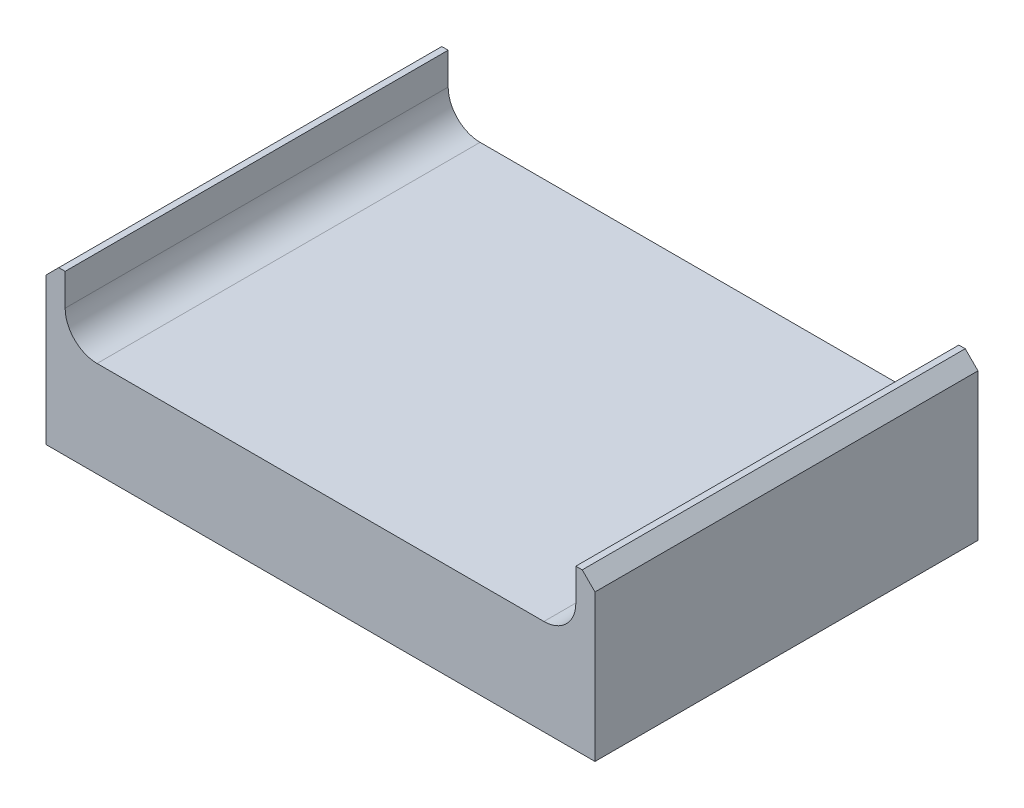
ISO-10303-21;
HEADER;
FILE_DESCRIPTION(('STEP AP214'),'2;1');
FILE_NAME('part.step','',(''),(''),'','','');
FILE_SCHEMA(('AUTOMOTIVE_DESIGN { 1 0 10303 214 1 1 1 1 }'));
ENDSEC;
DATA;
#1=APPLICATION_CONTEXT('core data for automotive mechanical design processes');
#2=APPLICATION_PROTOCOL_DEFINITION('international standard','automotive_design',2000,#1);
#3=PRODUCT_CONTEXT('',#1,'mechanical');
#4=PRODUCT('Part','Part','',(#3));
#5=PRODUCT_RELATED_PRODUCT_CATEGORY('part','',(#4));
#6=PRODUCT_DEFINITION_FORMATION('','',#4);
#7=PRODUCT_DEFINITION_CONTEXT('part definition',#1,'design');
#8=PRODUCT_DEFINITION('design','',#6,#7);
#9=PRODUCT_DEFINITION_SHAPE('','',#8);
#10=(LENGTH_UNIT() NAMED_UNIT(*) SI_UNIT(.MILLI.,.METRE.));
#11=(NAMED_UNIT(*) PLANE_ANGLE_UNIT() SI_UNIT($,.RADIAN.));
#12=(NAMED_UNIT(*) SI_UNIT($,.STERADIAN.) SOLID_ANGLE_UNIT());
#13=UNCERTAINTY_MEASURE_WITH_UNIT(LENGTH_MEASURE(1.E-05),#10,'distance_accuracy_value','');
#14=(GEOMETRIC_REPRESENTATION_CONTEXT(3) GLOBAL_UNCERTAINTY_ASSIGNED_CONTEXT((#13)) GLOBAL_UNIT_ASSIGNED_CONTEXT((#10,
#11,#12)) REPRESENTATION_CONTEXT('',''));
#15=CARTESIAN_POINT('',(0.,0.,0.));
#16=DIRECTION('',(0.,0.,1.));
#17=DIRECTION('',(1.,0.,0.));
#18=AXIS2_PLACEMENT_3D('',#15,#16,#17);
#19=CARTESIAN_POINT('',(43.,12.5,60.));
#20=DIRECTION('',(-1.,0.,0.));
#21=DIRECTION('',(0.,-1.,0.));
#22=AXIS2_PLACEMENT_3D('',#19,#20,#21);
#23=PLANE('',#22);
#24=DIRECTION('',(0.,1.,0.));
#25=VECTOR('',#24,1.);
#26=CARTESIAN_POINT('',(43.,12.5,0.));
#27=LINE('',#26,#25);
#28=CARTESIAN_POINT('',(43.,-12.5,0.));
#29=VERTEX_POINT('',#28);
#30=CARTESIAN_POINT('',(43.,10.5,0.));
#31=VERTEX_POINT('',#30);
#32=EDGE_CURVE('E163',#29,#31,#27,.T.);
#33=ORIENTED_EDGE('',*,*,#32,.T.);
#34=DIRECTION('',(0.,0.,1.));
#35=VECTOR('',#34,1.);
#36=CARTESIAN_POINT('',(43.,10.5,60.));
#37=LINE('',#36,#35);
#38=CARTESIAN_POINT('',(43.,10.5,60.));
#39=VERTEX_POINT('',#38);
#40=EDGE_CURVE('E12',#31,#39,#37,.T.);
#41=ORIENTED_EDGE('',*,*,#40,.T.);
#42=DIRECTION('',(0.,1.,0.));
#43=VECTOR('',#42,1.);
#44=CARTESIAN_POINT('',(43.,12.5,60.));
#45=LINE('',#44,#43);
#46=CARTESIAN_POINT('',(43.,-12.5,60.));
#47=VERTEX_POINT('',#46);
#48=EDGE_CURVE('E132',#47,#39,#45,.T.);
#49=ORIENTED_EDGE('',*,*,#48,.F.);
#50=DIRECTION('',(0.,0.,-1.));
#51=VECTOR('',#50,1.);
#52=CARTESIAN_POINT('',(43.,-12.5,60.));
#53=LINE('',#52,#51);
#54=EDGE_CURVE('E162',#47,#29,#53,.T.);
#55=ORIENTED_EDGE('',*,*,#54,.T.);
#56=EDGE_LOOP('',(#33,#41,#49,#55));
#57=FACE_BOUND('',#56,.T.);
#58=ADVANCED_FACE('F35',(#57),#23,.F.);
#59=CARTESIAN_POINT('',(40.,12.5,60.));
#60=DIRECTION('',(0.,-1.,0.));
#61=DIRECTION('',(0.,0.,-1.));
#62=AXIS2_PLACEMENT_3D('',#59,#60,#61);
#63=PLANE('',#62);
#64=DIRECTION('',(-1.,0.,0.));
#65=VECTOR('',#64,1.);
#66=CARTESIAN_POINT('',(40.,12.5,60.));
#67=LINE('',#66,#65);
#68=CARTESIAN_POINT('',(41.,12.5,60.));
#69=VERTEX_POINT('',#68);
#70=CARTESIAN_POINT('',(40.,12.5,60.));
#71=VERTEX_POINT('',#70);
#72=EDGE_CURVE('E122',#69,#71,#67,.T.);
#73=ORIENTED_EDGE('',*,*,#72,.F.);
#74=DIRECTION('',(0.,0.,-1.));
#75=VECTOR('',#74,1.);
#76=CARTESIAN_POINT('',(41.,12.5,60.));
#77=LINE('',#76,#75);
#78=CARTESIAN_POINT('',(41.,12.5,0.));
#79=VERTEX_POINT('',#78);
#80=EDGE_CURVE('E43',#69,#79,#77,.T.);
#81=ORIENTED_EDGE('',*,*,#80,.T.);
#82=DIRECTION('',(-1.,0.,0.));
#83=VECTOR('',#82,1.);
#84=CARTESIAN_POINT('',(40.,12.5,0.));
#85=LINE('',#84,#83);
#86=CARTESIAN_POINT('',(40.,12.5,0.));
#87=VERTEX_POINT('',#86);
#88=EDGE_CURVE('E138',#79,#87,#85,.T.);
#89=ORIENTED_EDGE('',*,*,#88,.T.);
#90=DIRECTION('',(0.,0.,-1.));
#91=VECTOR('',#90,1.);
#92=CARTESIAN_POINT('',(40.,12.5,60.));
#93=LINE('',#92,#91);
#94=EDGE_CURVE('E135',#71,#87,#93,.T.);
#95=ORIENTED_EDGE('',*,*,#94,.F.);
#96=EDGE_LOOP('',(#73,#81,#89,#95));
#97=FACE_BOUND('',#96,.T.);
#98=ADVANCED_FACE('F136',(#97),#63,.F.);
#99=CARTESIAN_POINT('',(40.,12.5,60.));
#100=DIRECTION('',(1.,0.,0.));
#101=DIRECTION('',(0.,0.,-1.));
#102=AXIS2_PLACEMENT_3D('',#99,#100,#101);
#103=PLANE('',#102);
#104=DIRECTION('',(0.,-1.,0.));
#105=VECTOR('',#104,1.);
#106=CARTESIAN_POINT('',(40.,12.5,0.));
#107=LINE('',#106,#105);
#108=CARTESIAN_POINT('',(40.,7.50000000000001,0.));
#109=VERTEX_POINT('',#108);
#110=EDGE_CURVE('E166',#87,#109,#107,.T.);
#111=ORIENTED_EDGE('',*,*,#110,.T.);
#112=DIRECTION('',(0.,0.,-1.));
#113=VECTOR('',#112,1.);
#114=CARTESIAN_POINT('',(40.,7.50000000000001,60.));
#115=LINE('',#114,#113);
#116=CARTESIAN_POINT('',(40.,7.50000000000001,60.));
#117=VERTEX_POINT('',#116);
#118=EDGE_CURVE('E147',#109,#117,#115,.F.);
#119=ORIENTED_EDGE('',*,*,#118,.T.);
#120=DIRECTION('',(0.,-1.,0.));
#121=VECTOR('',#120,1.);
#122=CARTESIAN_POINT('',(40.,12.5,60.));
#123=LINE('',#122,#121);
#124=EDGE_CURVE('E127',#71,#117,#123,.T.);
#125=ORIENTED_EDGE('',*,*,#124,.F.);
#126=ORIENTED_EDGE('',*,*,#94,.T.);
#127=EDGE_LOOP('',(#111,#119,#125,#126));
#128=FACE_BOUND('',#127,.T.);
#129=ADVANCED_FACE('F145',(#128),#103,.F.);
#130=CARTESIAN_POINT('',(-40.,2.50000000000001,60.));
#131=DIRECTION('',(0.,-1.,0.));
#132=DIRECTION('',(0.,0.,-1.));
#133=AXIS2_PLACEMENT_3D('',#130,#131,#132);
#134=PLANE('',#133);
#135=DIRECTION('',(-1.,0.,0.));
#136=VECTOR('',#135,1.);
#137=CARTESIAN_POINT('',(-40.,2.50000000000001,0.));
#138=LINE('',#137,#136);
#139=CARTESIAN_POINT('',(35.,2.50000000000001,0.));
#140=VERTEX_POINT('',#139);
#141=CARTESIAN_POINT('',(-35.,2.50000000000001,0.));
#142=VERTEX_POINT('',#141);
#143=EDGE_CURVE('E168',#140,#142,#138,.T.);
#144=ORIENTED_EDGE('',*,*,#143,.T.);
#145=DIRECTION('',(0.,0.,-1.));
#146=VECTOR('',#145,1.);
#147=CARTESIAN_POINT('',(-35.,2.50000000000001,60.));
#148=LINE('',#147,#146);
#149=CARTESIAN_POINT('',(-35.,2.50000000000001,60.));
#150=VERTEX_POINT('',#149);
#151=EDGE_CURVE('E192',#142,#150,#148,.F.);
#152=ORIENTED_EDGE('',*,*,#151,.T.);
#153=DIRECTION('',(-1.,0.,0.));
#154=VECTOR('',#153,1.);
#155=CARTESIAN_POINT('',(-40.,2.50000000000001,60.));
#156=LINE('',#155,#154);
#157=CARTESIAN_POINT('',(35.,2.50000000000001,60.));
#158=VERTEX_POINT('',#157);
#159=EDGE_CURVE('E148',#158,#150,#156,.T.);
#160=ORIENTED_EDGE('',*,*,#159,.F.);
#161=DIRECTION('',(0.,0.,-1.));
#162=VECTOR('',#161,1.);
#163=CARTESIAN_POINT('',(35.,2.50000000000001,0.));
#164=LINE('',#163,#162);
#165=EDGE_CURVE('E189',#158,#140,#164,.T.);
#166=ORIENTED_EDGE('',*,*,#165,.T.);
#167=EDGE_LOOP('',(#144,#152,#160,#166));
#168=FACE_BOUND('',#167,.T.);
#169=ADVANCED_FACE('F226',(#168),#134,.F.);
#170=CARTESIAN_POINT('',(-40.,12.5,60.));
#171=DIRECTION('',(-1.,0.,0.));
#172=DIRECTION('',(0.,0.,1.));
#173=AXIS2_PLACEMENT_3D('',#170,#171,#172);
#174=PLANE('',#173);
#175=DIRECTION('',(0.,1.,0.));
#176=VECTOR('',#175,1.);
#177=CARTESIAN_POINT('',(-40.,12.5,60.));
#178=LINE('',#177,#176);
#179=CARTESIAN_POINT('',(-40.,7.50000000000001,60.));
#180=VERTEX_POINT('',#179);
#181=CARTESIAN_POINT('',(-40.,12.5,60.));
#182=VERTEX_POINT('',#181);
#183=EDGE_CURVE('E151',#180,#182,#178,.T.);
#184=ORIENTED_EDGE('',*,*,#183,.F.);
#185=DIRECTION('',(0.,0.,-1.));
#186=VECTOR('',#185,1.);
#187=CARTESIAN_POINT('',(-40.,7.50000000000001,0.));
#188=LINE('',#187,#186);
#189=CARTESIAN_POINT('',(-40.,7.50000000000001,0.));
#190=VERTEX_POINT('',#189);
#191=EDGE_CURVE('E142',#180,#190,#188,.T.);
#192=ORIENTED_EDGE('',*,*,#191,.T.);
#193=DIRECTION('',(0.,1.,0.));
#194=VECTOR('',#193,1.);
#195=CARTESIAN_POINT('',(-40.,12.5,0.));
#196=LINE('',#195,#194);
#197=CARTESIAN_POINT('',(-40.,12.5,0.));
#198=VERTEX_POINT('',#197);
#199=EDGE_CURVE('E171',#190,#198,#196,.T.);
#200=ORIENTED_EDGE('',*,*,#199,.T.);
#201=DIRECTION('',(0.,0.,-1.));
#202=VECTOR('',#201,1.);
#203=CARTESIAN_POINT('',(-40.,12.5,60.));
#204=LINE('',#203,#202);
#205=EDGE_CURVE('E143',#182,#198,#204,.T.);
#206=ORIENTED_EDGE('',*,*,#205,.F.);
#207=EDGE_LOOP('',(#184,#192,#200,#206));
#208=FACE_BOUND('',#207,.T.);
#209=ADVANCED_FACE('F234',(#208),#174,.F.);
#210=CARTESIAN_POINT('',(-43.,12.5,60.));
#211=DIRECTION('',(0.,-1.,0.));
#212=DIRECTION('',(0.,0.,-1.));
#213=AXIS2_PLACEMENT_3D('',#210,#211,#212);
#214=PLANE('',#213);
#215=DIRECTION('',(-1.,0.,0.));
#216=VECTOR('',#215,1.);
#217=CARTESIAN_POINT('',(-43.,12.5,0.));
#218=LINE('',#217,#216);
#219=CARTESIAN_POINT('',(-41.,12.5,0.));
#220=VERTEX_POINT('',#219);
#221=EDGE_CURVE('E173',#198,#220,#218,.T.);
#222=ORIENTED_EDGE('',*,*,#221,.T.);
#223=DIRECTION('',(0.,0.,1.));
#224=VECTOR('',#223,1.);
#225=CARTESIAN_POINT('',(-41.,12.5,60.));
#226=LINE('',#225,#224);
#227=CARTESIAN_POINT('',(-41.,12.5,60.));
#228=VERTEX_POINT('',#227);
#229=EDGE_CURVE('E210',#220,#228,#226,.T.);
#230=ORIENTED_EDGE('',*,*,#229,.T.);
#231=DIRECTION('',(-1.,0.,0.));
#232=VECTOR('',#231,1.);
#233=CARTESIAN_POINT('',(-43.,12.5,60.));
#234=LINE('',#233,#232);
#235=EDGE_CURVE('E156',#182,#228,#234,.T.);
#236=ORIENTED_EDGE('',*,*,#235,.F.);
#237=ORIENTED_EDGE('',*,*,#205,.T.);
#238=EDGE_LOOP('',(#222,#230,#236,#237));
#239=FACE_BOUND('',#238,.T.);
#240=ADVANCED_FACE('F239',(#239),#214,.F.);
#241=CARTESIAN_POINT('',(-43.,12.5,60.));
#242=DIRECTION('',(1.,0.,0.));
#243=DIRECTION('',(0.,1.,0.));
#244=AXIS2_PLACEMENT_3D('',#241,#242,#243);
#245=PLANE('',#244);
#246=DIRECTION('',(0.,-1.,0.));
#247=VECTOR('',#246,1.);
#248=CARTESIAN_POINT('',(-43.,12.5,60.));
#249=LINE('',#248,#247);
#250=CARTESIAN_POINT('',(-43.,10.5,60.));
#251=VERTEX_POINT('',#250);
#252=CARTESIAN_POINT('',(-43.,-12.5,60.));
#253=VERTEX_POINT('',#252);
#254=EDGE_CURVE('E158',#251,#253,#249,.T.);
#255=ORIENTED_EDGE('',*,*,#254,.F.);
#256=DIRECTION('',(0.,0.,-1.));
#257=VECTOR('',#256,1.);
#258=CARTESIAN_POINT('',(-43.,10.5,60.));
#259=LINE('',#258,#257);
#260=CARTESIAN_POINT('',(-43.,10.5,0.));
#261=VERTEX_POINT('',#260);
#262=EDGE_CURVE('E203',#251,#261,#259,.T.);
#263=ORIENTED_EDGE('',*,*,#262,.T.);
#264=DIRECTION('',(0.,-1.,0.));
#265=VECTOR('',#264,1.);
#266=CARTESIAN_POINT('',(-43.,12.5,0.));
#267=LINE('',#266,#265);
#268=CARTESIAN_POINT('',(-43.,-12.5,0.));
#269=VERTEX_POINT('',#268);
#270=EDGE_CURVE('E176',#261,#269,#267,.T.);
#271=ORIENTED_EDGE('',*,*,#270,.T.);
#272=DIRECTION('',(0.,0.,-1.));
#273=VECTOR('',#272,1.);
#274=CARTESIAN_POINT('',(-43.,-12.5,60.));
#275=LINE('',#274,#273);
#276=EDGE_CURVE('E182',#253,#269,#275,.T.);
#277=ORIENTED_EDGE('',*,*,#276,.F.);
#278=EDGE_LOOP('',(#255,#263,#271,#277));
#279=FACE_BOUND('',#278,.T.);
#280=ADVANCED_FACE('F247',(#279),#245,.F.);
#281=CARTESIAN_POINT('',(-43.,-12.5,60.));
#282=DIRECTION('',(0.,1.,0.));
#283=DIRECTION('',(0.,0.,1.));
#284=AXIS2_PLACEMENT_3D('',#281,#282,#283);
#285=PLANE('',#284);
#286=DIRECTION('',(1.,0.,0.));
#287=VECTOR('',#286,1.);
#288=CARTESIAN_POINT('',(-43.,-12.5,0.));
#289=LINE('',#288,#287);
#290=EDGE_CURVE('E178',#269,#29,#289,.T.);
#291=ORIENTED_EDGE('',*,*,#290,.T.);
#292=ORIENTED_EDGE('',*,*,#54,.F.);
#293=DIRECTION('',(1.,0.,0.));
#294=VECTOR('',#293,1.);
#295=CARTESIAN_POINT('',(-43.,-12.5,60.));
#296=LINE('',#295,#294);
#297=EDGE_CURVE('E160',#253,#47,#296,.T.);
#298=ORIENTED_EDGE('',*,*,#297,.F.);
#299=ORIENTED_EDGE('',*,*,#276,.T.);
#300=EDGE_LOOP('',(#291,#292,#298,#299));
#301=FACE_BOUND('',#300,.T.);
#302=ADVANCED_FACE('F252',(#301),#285,.F.);
#303=CARTESIAN_POINT('',(0.,0.,60.));
#304=DIRECTION('',(0.,0.,1.));
#305=DIRECTION('',(1.,0.,0.));
#306=AXIS2_PLACEMENT_3D('',#303,#304,#305);
#307=PLANE('',#306);
#308=ORIENTED_EDGE('',*,*,#235,.T.);
#309=DIRECTION('',(0.707106781186548,0.707106781186548,0.));
#310=VECTOR('',#309,1.);
#311=CARTESIAN_POINT('',(-26.75,26.75,60.));
#312=LINE('',#311,#310);
#313=EDGE_CURVE('E213',#228,#251,#312,.F.);
#314=ORIENTED_EDGE('',*,*,#313,.T.);
#315=ORIENTED_EDGE('',*,*,#254,.T.);
#316=ORIENTED_EDGE('',*,*,#297,.T.);
#317=ORIENTED_EDGE('',*,*,#48,.T.);
#318=DIRECTION('',(0.707106781186548,-0.707106781186548,0.));
#319=VECTOR('',#318,1.);
#320=CARTESIAN_POINT('',(26.75,26.75,60.));
#321=LINE('',#320,#319);
#322=EDGE_CURVE('E50',#39,#69,#321,.F.);
#323=ORIENTED_EDGE('',*,*,#322,.T.);
#324=ORIENTED_EDGE('',*,*,#72,.T.);
#325=ORIENTED_EDGE('',*,*,#124,.T.);
#326=CARTESIAN_POINT('',(35.,7.50000000000001,60.));
#327=DIRECTION('',(0.,0.,1.));
#328=DIRECTION('',(1.,0.,0.));
#329=AXIS2_PLACEMENT_3D('',#326,#327,#328);
#330=CIRCLE('',#329,5.);
#331=EDGE_CURVE('E201',#117,#158,#330,.F.);
#332=ORIENTED_EDGE('',*,*,#331,.T.);
#333=ORIENTED_EDGE('',*,*,#159,.T.);
#334=CARTESIAN_POINT('',(-35.,7.50000000000001,60.));
#335=DIRECTION('',(0.,0.,1.));
#336=DIRECTION('',(1.,0.,0.));
#337=AXIS2_PLACEMENT_3D('',#334,#335,#336);
#338=CIRCLE('',#337,5.);
#339=EDGE_CURVE('E197',#150,#180,#338,.F.);
#340=ORIENTED_EDGE('',*,*,#339,.T.);
#341=ORIENTED_EDGE('',*,*,#183,.T.);
#342=EDGE_LOOP('',(#308,#314,#315,#316,#317,#323,#324,#325,#332,#333,#340,#341));
#343=FACE_BOUND('',#342,.T.);
#344=ADVANCED_FACE('F125',(#343),#307,.T.);
#345=CARTESIAN_POINT('',(0.,0.,0.));
#346=DIRECTION('',(0.,0.,1.));
#347=DIRECTION('',(1.,0.,0.));
#348=AXIS2_PLACEMENT_3D('',#345,#346,#347);
#349=PLANE('',#348);
#350=ORIENTED_EDGE('',*,*,#270,.F.);
#351=DIRECTION('',(-0.707106781186548,-0.707106781186548,0.));
#352=VECTOR('',#351,1.);
#353=CARTESIAN_POINT('',(-43.,10.5,0.));
#354=LINE('',#353,#352);
#355=EDGE_CURVE('E208',#261,#220,#354,.F.);
#356=ORIENTED_EDGE('',*,*,#355,.T.);
#357=ORIENTED_EDGE('',*,*,#221,.F.);
#358=ORIENTED_EDGE('',*,*,#199,.F.);
#359=CARTESIAN_POINT('',(-35.,7.50000000000001,0.));
#360=DIRECTION('',(0.,0.,1.));
#361=DIRECTION('',(1.,0.,0.));
#362=AXIS2_PLACEMENT_3D('',#359,#360,#361);
#363=CIRCLE('',#362,5.);
#364=EDGE_CURVE('E195',#190,#142,#363,.T.);
#365=ORIENTED_EDGE('',*,*,#364,.T.);
#366=ORIENTED_EDGE('',*,*,#143,.F.);
#367=CARTESIAN_POINT('',(35.,7.50000000000001,0.));
#368=DIRECTION('',(0.,0.,1.));
#369=DIRECTION('',(1.,0.,0.));
#370=AXIS2_PLACEMENT_3D('',#367,#368,#369);
#371=CIRCLE('',#370,5.);
#372=EDGE_CURVE('E199',#140,#109,#371,.T.);
#373=ORIENTED_EDGE('',*,*,#372,.T.);
#374=ORIENTED_EDGE('',*,*,#110,.F.);
#375=ORIENTED_EDGE('',*,*,#88,.F.);
#376=DIRECTION('',(-0.707106781186548,0.707106781186548,0.));
#377=VECTOR('',#376,1.);
#378=CARTESIAN_POINT('',(41.,12.5,0.));
#379=LINE('',#378,#377);
#380=EDGE_CURVE('E206',#79,#31,#379,.F.);
#381=ORIENTED_EDGE('',*,*,#380,.T.);
#382=ORIENTED_EDGE('',*,*,#32,.F.);
#383=ORIENTED_EDGE('',*,*,#290,.F.);
#384=EDGE_LOOP('',(#350,#356,#357,#358,#365,#366,#373,#374,#375,#381,#382,#383));
#385=FACE_BOUND('',#384,.T.);
#386=ADVANCED_FACE('F217',(#385),#349,.F.);
#387=CARTESIAN_POINT('',(-35.,7.50000000000001,60.));
#388=DIRECTION('',(0.,0.,1.));
#389=DIRECTION('',(1.,0.,0.));
#390=AXIS2_PLACEMENT_3D('',#387,#388,#389);
#391=CYLINDRICAL_SURFACE('',#390,5.);
#392=ORIENTED_EDGE('',*,*,#339,.F.);
#393=ORIENTED_EDGE('',*,*,#151,.F.);
#394=ORIENTED_EDGE('',*,*,#364,.F.);
#395=ORIENTED_EDGE('',*,*,#191,.F.);
#396=EDGE_LOOP('',(#392,#393,#394,#395));
#397=FACE_BOUND('',#396,.T.);
#398=ADVANCED_FACE('F229',(#397),#391,.F.);
#399=CARTESIAN_POINT('',(35.,7.50000000000001,60.));
#400=DIRECTION('',(0.,0.,1.));
#401=DIRECTION('',(1.,0.,0.));
#402=AXIS2_PLACEMENT_3D('',#399,#400,#401);
#403=CYLINDRICAL_SURFACE('',#402,5.);
#404=ORIENTED_EDGE('',*,*,#331,.F.);
#405=ORIENTED_EDGE('',*,*,#118,.F.);
#406=ORIENTED_EDGE('',*,*,#372,.F.);
#407=ORIENTED_EDGE('',*,*,#165,.F.);
#408=EDGE_LOOP('',(#404,#405,#406,#407));
#409=FACE_BOUND('',#408,.T.);
#410=ADVANCED_FACE('F221',(#409),#403,.F.);
#411=CARTESIAN_POINT('',(-43.,10.5,60.));
#412=DIRECTION('',(0.707106781186547,-0.707106781186547,0.));
#413=DIRECTION('',(0.,0.,-1.));
#414=AXIS2_PLACEMENT_3D('',#411,#412,#413);
#415=PLANE('',#414);
#416=ORIENTED_EDGE('',*,*,#313,.F.);
#417=ORIENTED_EDGE('',*,*,#229,.F.);
#418=ORIENTED_EDGE('',*,*,#355,.F.);
#419=ORIENTED_EDGE('',*,*,#262,.F.);
#420=EDGE_LOOP('',(#416,#417,#418,#419));
#421=FACE_BOUND('',#420,.T.);
#422=ADVANCED_FACE('F245',(#421),#415,.F.);
#423=CARTESIAN_POINT('',(41.,12.5,60.));
#424=DIRECTION('',(-0.707106781186547,-0.707106781186547,0.));
#425=DIRECTION('',(0.,0.,-1.));
#426=AXIS2_PLACEMENT_3D('',#423,#424,#425);
#427=PLANE('',#426);
#428=ORIENTED_EDGE('',*,*,#322,.F.);
#429=ORIENTED_EDGE('',*,*,#40,.F.);
#430=ORIENTED_EDGE('',*,*,#380,.F.);
#431=ORIENTED_EDGE('',*,*,#80,.F.);
#432=EDGE_LOOP('',(#428,#429,#430,#431));
#433=FACE_BOUND('',#432,.T.);
#434=ADVANCED_FACE('F37',(#433),#427,.F.);
#435=CLOSED_SHELL('',(#58,#98,#129,#169,#209,#240,#280,#302,#344,#386,#398,#410,#422,#434));
#436=MANIFOLD_SOLID_BREP('B2',#435);
#437=ADVANCED_BREP_SHAPE_REPRESENTATION('',(#18,#436),#14);
#438=SHAPE_DEFINITION_REPRESENTATION(#9,#437);
ENDSEC;
END-ISO-10303-21;
